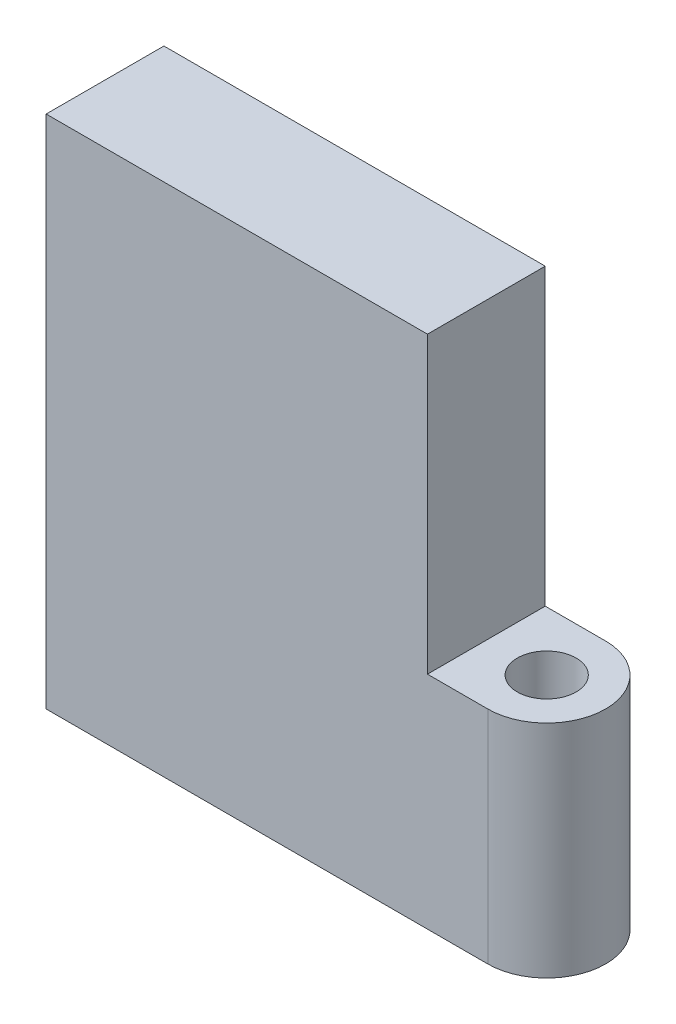
ISO-10303-21;
HEADER;
FILE_DESCRIPTION(('STEP AP214'),'2;1');
FILE_NAME('part.step','',(''),(''),'','','');
FILE_SCHEMA(('AUTOMOTIVE_DESIGN { 1 0 10303 214 1 1 1 1 }'));
ENDSEC;
DATA;
#1=APPLICATION_CONTEXT('core data for automotive mechanical design processes');
#2=APPLICATION_PROTOCOL_DEFINITION('international standard','automotive_design',2000,#1);
#3=PRODUCT_CONTEXT('',#1,'mechanical');
#4=PRODUCT('Part','Part','',(#3));
#5=PRODUCT_RELATED_PRODUCT_CATEGORY('part','',(#4));
#6=PRODUCT_DEFINITION_FORMATION('','',#4);
#7=PRODUCT_DEFINITION_CONTEXT('part definition',#1,'design');
#8=PRODUCT_DEFINITION('design','',#6,#7);
#9=PRODUCT_DEFINITION_SHAPE('','',#8);
#10=(LENGTH_UNIT() NAMED_UNIT(*) SI_UNIT(.MILLI.,.METRE.));
#11=(NAMED_UNIT(*) PLANE_ANGLE_UNIT() SI_UNIT($,.RADIAN.));
#12=(NAMED_UNIT(*) SI_UNIT($,.STERADIAN.) SOLID_ANGLE_UNIT());
#13=UNCERTAINTY_MEASURE_WITH_UNIT(LENGTH_MEASURE(1.E-05),#10,'distance_accuracy_value','');
#14=(GEOMETRIC_REPRESENTATION_CONTEXT(3) GLOBAL_UNCERTAINTY_ASSIGNED_CONTEXT((#13)) GLOBAL_UNIT_ASSIGNED_CONTEXT((#10,
#11,#12)) REPRESENTATION_CONTEXT('',''));
#15=CARTESIAN_POINT('',(0.,0.,0.));
#16=DIRECTION('',(0.,0.,1.));
#17=DIRECTION('',(1.,0.,0.));
#18=AXIS2_PLACEMENT_3D('',#15,#16,#17);
#19=CARTESIAN_POINT('',(0.,15.,4.));
#20=DIRECTION('',(0.,0.,1.));
#21=DIRECTION('',(1.,0.,0.));
#22=AXIS2_PLACEMENT_3D('',#19,#20,#21);
#23=PLANE('',#22);
#24=DIRECTION('',(-1.,0.,0.));
#25=VECTOR('',#24,1.);
#26=CARTESIAN_POINT('',(0.,0.,4.));
#27=LINE('',#26,#25);
#28=CARTESIAN_POINT('',(0.,0.,4.));
#29=VERTEX_POINT('',#28);
#30=CARTESIAN_POINT('',(-30.,0.,4.));
#31=VERTEX_POINT('',#30);
#32=EDGE_CURVE('E77',#29,#31,#27,.T.);
#33=ORIENTED_EDGE('',*,*,#32,.F.);
#34=DIRECTION('',(0.,-1.,0.));
#35=VECTOR('',#34,1.);
#36=CARTESIAN_POINT('',(0.,15.,4.));
#37=LINE('',#36,#35);
#38=CARTESIAN_POINT('',(0.,15.,4.));
#39=VERTEX_POINT('',#38);
#40=EDGE_CURVE('E11',#39,#29,#37,.T.);
#41=ORIENTED_EDGE('',*,*,#40,.F.);
#42=DIRECTION('',(-1.,0.,0.));
#43=VECTOR('',#42,1.);
#44=CARTESIAN_POINT('',(0.,15.,4.));
#45=LINE('',#44,#43);
#46=CARTESIAN_POINT('',(-4.1,15.,4.));
#47=VERTEX_POINT('',#46);
#48=EDGE_CURVE('E101',#39,#47,#45,.T.);
#49=ORIENTED_EDGE('',*,*,#48,.T.);
#50=DIRECTION('',(0.,-1.,0.));
#51=VECTOR('',#50,1.);
#52=CARTESIAN_POINT('',(-4.1,35.,4.));
#53=LINE('',#52,#51);
#54=CARTESIAN_POINT('',(-4.1,35.,4.));
#55=VERTEX_POINT('',#54);
#56=EDGE_CURVE('E121',#55,#47,#53,.T.);
#57=ORIENTED_EDGE('',*,*,#56,.F.);
#58=DIRECTION('',(1.,0.,0.));
#59=VECTOR('',#58,1.);
#60=CARTESIAN_POINT('',(-30.,35.,4.));
#61=LINE('',#60,#59);
#62=CARTESIAN_POINT('',(-30.,35.,4.));
#63=VERTEX_POINT('',#62);
#64=EDGE_CURVE('E81',#63,#55,#61,.T.);
#65=ORIENTED_EDGE('',*,*,#64,.F.);
#66=DIRECTION('',(0.,-1.,0.));
#67=VECTOR('',#66,1.);
#68=CARTESIAN_POINT('',(-30.,15.,4.));
#69=LINE('',#68,#67);
#70=EDGE_CURVE('E75',#63,#31,#69,.T.);
#71=ORIENTED_EDGE('',*,*,#70,.T.);
#72=EDGE_LOOP('',(#33,#41,#49,#57,#65,#71));
#73=FACE_BOUND('',#72,.T.);
#74=ADVANCED_FACE('F35',(#73),#23,.T.);
#75=CARTESIAN_POINT('',(0.,15.,0.));
#76=DIRECTION('',(0.,-1.,0.));
#77=DIRECTION('',(0.,0.,-1.));
#78=AXIS2_PLACEMENT_3D('',#75,#76,#77);
#79=CYLINDRICAL_SURFACE('',#78,4.);
#80=CARTESIAN_POINT('',(0.,0.,0.));
#81=DIRECTION('',(0.,1.,0.));
#82=DIRECTION('',(0.,0.,1.));
#83=AXIS2_PLACEMENT_3D('',#80,#81,#82);
#84=CIRCLE('',#83,4.);
#85=CARTESIAN_POINT('',(0.,0.,-4.));
#86=VERTEX_POINT('',#85);
#87=EDGE_CURVE('E95',#29,#86,#84,.T.);
#88=ORIENTED_EDGE('',*,*,#87,.T.);
#89=DIRECTION('',(0.,-1.,0.));
#90=VECTOR('',#89,1.);
#91=CARTESIAN_POINT('',(0.,15.,-4.));
#92=LINE('',#91,#90);
#93=CARTESIAN_POINT('',(0.,15.,-4.));
#94=VERTEX_POINT('',#93);
#95=EDGE_CURVE('E42',#94,#86,#92,.T.);
#96=ORIENTED_EDGE('',*,*,#95,.F.);
#97=CARTESIAN_POINT('',(0.,15.,0.));
#98=DIRECTION('',(0.,1.,0.));
#99=DIRECTION('',(0.,0.,1.));
#100=AXIS2_PLACEMENT_3D('',#97,#98,#99);
#101=CIRCLE('',#100,4.);
#102=EDGE_CURVE('E55',#39,#94,#101,.T.);
#103=ORIENTED_EDGE('',*,*,#102,.F.);
#104=ORIENTED_EDGE('',*,*,#40,.T.);
#105=EDGE_LOOP('',(#88,#96,#103,#104));
#106=FACE_BOUND('',#105,.T.);
#107=ADVANCED_FACE('F114',(#106),#79,.T.);
#108=CARTESIAN_POINT('',(0.,15.,-4.));
#109=DIRECTION('',(0.,0.,1.));
#110=DIRECTION('',(1.,0.,0.));
#111=AXIS2_PLACEMENT_3D('',#108,#109,#110);
#112=PLANE('',#111);
#113=DIRECTION('',(-1.,0.,0.));
#114=VECTOR('',#113,1.);
#115=CARTESIAN_POINT('',(0.,0.,-4.));
#116=LINE('',#115,#114);
#117=CARTESIAN_POINT('',(-30.,0.,-4.));
#118=VERTEX_POINT('',#117);
#119=EDGE_CURVE('E102',#86,#118,#116,.T.);
#120=ORIENTED_EDGE('',*,*,#119,.T.);
#121=DIRECTION('',(0.,-1.,0.));
#122=VECTOR('',#121,1.);
#123=CARTESIAN_POINT('',(-30.,15.,-4.));
#124=LINE('',#123,#122);
#125=CARTESIAN_POINT('',(-30.,35.,-4.));
#126=VERTEX_POINT('',#125);
#127=EDGE_CURVE('E86',#126,#118,#124,.T.);
#128=ORIENTED_EDGE('',*,*,#127,.F.);
#129=DIRECTION('',(-1.,0.,0.));
#130=VECTOR('',#129,1.);
#131=CARTESIAN_POINT('',(-30.,35.,-4.));
#132=LINE('',#131,#130);
#133=CARTESIAN_POINT('',(-4.1,35.,-4.00000000000001));
#134=VERTEX_POINT('',#133);
#135=EDGE_CURVE('E128',#134,#126,#132,.T.);
#136=ORIENTED_EDGE('',*,*,#135,.F.);
#137=DIRECTION('',(0.,-1.,0.));
#138=VECTOR('',#137,1.);
#139=CARTESIAN_POINT('',(-4.1,35.,-4.00000000000001));
#140=LINE('',#139,#138);
#141=CARTESIAN_POINT('',(-4.1,15.,-4.00000000000001));
#142=VERTEX_POINT('',#141);
#143=EDGE_CURVE('E126',#134,#142,#140,.T.);
#144=ORIENTED_EDGE('',*,*,#143,.T.);
#145=DIRECTION('',(-1.,0.,0.));
#146=VECTOR('',#145,1.);
#147=CARTESIAN_POINT('',(0.,15.,-4.));
#148=LINE('',#147,#146);
#149=EDGE_CURVE('E87',#94,#142,#148,.T.);
#150=ORIENTED_EDGE('',*,*,#149,.F.);
#151=ORIENTED_EDGE('',*,*,#95,.T.);
#152=EDGE_LOOP('',(#120,#128,#136,#144,#150,#151));
#153=FACE_BOUND('',#152,.T.);
#154=ADVANCED_FACE('F111',(#153),#112,.F.);
#155=CARTESIAN_POINT('',(-30.,15.,0.));
#156=DIRECTION('',(-1.,0.,0.));
#157=DIRECTION('',(0.,0.,1.));
#158=AXIS2_PLACEMENT_3D('',#155,#156,#157);
#159=PLANE('',#158);
#160=DIRECTION('',(0.,0.,-1.));
#161=VECTOR('',#160,1.);
#162=CARTESIAN_POINT('',(-30.,0.,0.));
#163=LINE('',#162,#161);
#164=EDGE_CURVE('E94',#31,#118,#163,.T.);
#165=ORIENTED_EDGE('',*,*,#164,.F.);
#166=ORIENTED_EDGE('',*,*,#70,.F.);
#167=DIRECTION('',(0.,0.,1.));
#168=VECTOR('',#167,1.);
#169=CARTESIAN_POINT('',(-30.,35.,-4.));
#170=LINE('',#169,#168);
#171=EDGE_CURVE('E130',#126,#63,#170,.T.);
#172=ORIENTED_EDGE('',*,*,#171,.F.);
#173=ORIENTED_EDGE('',*,*,#127,.T.);
#174=EDGE_LOOP('',(#165,#166,#172,#173));
#175=FACE_BOUND('',#174,.T.);
#176=ADVANCED_FACE('F98',(#175),#159,.T.);
#177=CARTESIAN_POINT('',(0.,15.,0.));
#178=DIRECTION('',(0.,1.,0.));
#179=DIRECTION('',(0.,0.,1.));
#180=AXIS2_PLACEMENT_3D('',#177,#178,#179);
#181=PLANE('',#180);
#182=DIRECTION('',(0.,0.,-1.));
#183=VECTOR('',#182,1.);
#184=CARTESIAN_POINT('',(-4.1,15.,-4.00000000000001));
#185=LINE('',#184,#183);
#186=EDGE_CURVE('E49',#47,#142,#185,.T.);
#187=ORIENTED_EDGE('',*,*,#186,.F.);
#188=ORIENTED_EDGE('',*,*,#48,.F.);
#189=ORIENTED_EDGE('',*,*,#102,.T.);
#190=ORIENTED_EDGE('',*,*,#149,.T.);
#191=EDGE_LOOP('',(#187,#188,#189,#190));
#192=FACE_BOUND('',#191,.T.);
#193=CARTESIAN_POINT('',(0.,15.,0.));
#194=DIRECTION('',(0.,1.,0.));
#195=DIRECTION('',(0.,0.,1.));
#196=AXIS2_PLACEMENT_3D('',#193,#194,#195);
#197=CIRCLE('',#196,2.);
#198=CARTESIAN_POINT('',(0.,15.,2.));
#199=VERTEX_POINT('',#198);
#200=EDGE_CURVE('E118',#199,#199,#197,.T.);
#201=ORIENTED_EDGE('',*,*,#200,.F.);
#202=EDGE_LOOP('',(#201));
#203=FACE_BOUND('',#202,.T.);
#204=ADVANCED_FACE('F147',(#192,#203),#181,.T.);
#205=CARTESIAN_POINT('',(0.,0.,0.));
#206=DIRECTION('',(0.,1.,0.));
#207=DIRECTION('',(0.,0.,1.));
#208=AXIS2_PLACEMENT_3D('',#205,#206,#207);
#209=PLANE('',#208);
#210=ORIENTED_EDGE('',*,*,#32,.T.);
#211=ORIENTED_EDGE('',*,*,#164,.T.);
#212=ORIENTED_EDGE('',*,*,#119,.F.);
#213=ORIENTED_EDGE('',*,*,#87,.F.);
#214=EDGE_LOOP('',(#210,#211,#212,#213));
#215=FACE_BOUND('',#214,.T.);
#216=ADVANCED_FACE('F92',(#215),#209,.F.);
#217=CARTESIAN_POINT('',(0.,2.5,0.));
#218=DIRECTION('',(0.,1.,0.));
#219=DIRECTION('',(0.,0.,1.));
#220=AXIS2_PLACEMENT_3D('',#217,#218,#219);
#221=CYLINDRICAL_SURFACE('',#220,2.);
#222=CARTESIAN_POINT('',(0.,2.5,0.));
#223=DIRECTION('',(0.,1.,0.));
#224=DIRECTION('',(0.,0.,1.));
#225=AXIS2_PLACEMENT_3D('',#222,#223,#224);
#226=CIRCLE('',#225,2.);
#227=CARTESIAN_POINT('',(0.,2.5,2.));
#228=VERTEX_POINT('',#227);
#229=EDGE_CURVE('E96',#228,#228,#226,.T.);
#230=ORIENTED_EDGE('',*,*,#229,.F.);
#231=EDGE_LOOP('',(#230));
#232=FACE_BOUND('',#231,.T.);
#233=ORIENTED_EDGE('',*,*,#200,.T.);
#234=EDGE_LOOP('',(#233));
#235=FACE_BOUND('',#234,.T.);
#236=ADVANCED_FACE('F162',(#232,#235),#221,.F.);
#237=CARTESIAN_POINT('',(0.,2.5,0.));
#238=DIRECTION('',(0.,1.,0.));
#239=DIRECTION('',(0.,0.,1.));
#240=AXIS2_PLACEMENT_3D('',#237,#238,#239);
#241=PLANE('',#240);
#242=ORIENTED_EDGE('',*,*,#229,.T.);
#243=EDGE_LOOP('',(#242));
#244=FACE_BOUND('',#243,.T.);
#245=ADVANCED_FACE('F154',(#244),#241,.T.);
#246=CARTESIAN_POINT('',(-4.1,35.,-4.00000000000001));
#247=DIRECTION('',(-1.,0.,0.));
#248=DIRECTION('',(0.,0.,1.));
#249=AXIS2_PLACEMENT_3D('',#246,#247,#248);
#250=PLANE('',#249);
#251=ORIENTED_EDGE('',*,*,#186,.T.);
#252=ORIENTED_EDGE('',*,*,#143,.F.);
#253=DIRECTION('',(0.,0.,-1.));
#254=VECTOR('',#253,1.);
#255=CARTESIAN_POINT('',(-4.1,35.,-4.00000000000001));
#256=LINE('',#255,#254);
#257=EDGE_CURVE('E133',#55,#134,#256,.T.);
#258=ORIENTED_EDGE('',*,*,#257,.F.);
#259=ORIENTED_EDGE('',*,*,#56,.T.);
#260=EDGE_LOOP('',(#251,#252,#258,#259));
#261=FACE_BOUND('',#260,.T.);
#262=ADVANCED_FACE('F151',(#261),#250,.F.);
#263=CARTESIAN_POINT('',(0.,35.,0.));
#264=DIRECTION('',(0.,1.,0.));
#265=DIRECTION('',(0.,0.,1.));
#266=AXIS2_PLACEMENT_3D('',#263,#264,#265);
#267=PLANE('',#266);
#268=ORIENTED_EDGE('',*,*,#171,.T.);
#269=ORIENTED_EDGE('',*,*,#64,.T.);
#270=ORIENTED_EDGE('',*,*,#257,.T.);
#271=ORIENTED_EDGE('',*,*,#135,.T.);
#272=EDGE_LOOP('',(#268,#269,#270,#271));
#273=FACE_BOUND('',#272,.T.);
#274=ADVANCED_FACE('F138',(#273),#267,.T.);
#275=CLOSED_SHELL('',(#74,#107,#154,#176,#204,#216,#236,#245,#262,#274));
#276=MANIFOLD_SOLID_BREP('B2',#275);
#277=ADVANCED_BREP_SHAPE_REPRESENTATION('',(#18,#276),#14);
#278=SHAPE_DEFINITION_REPRESENTATION(#9,#277);
ENDSEC;
END-ISO-10303-21;
